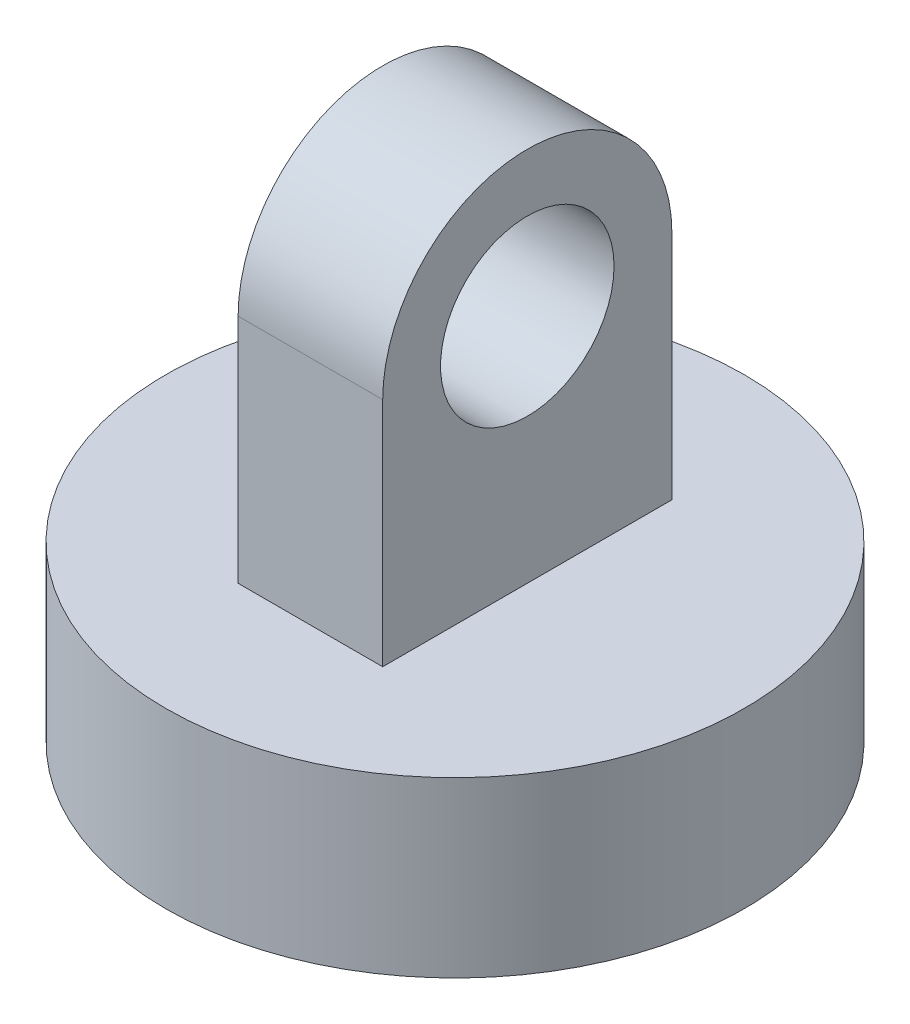
ISO-10303-21;
HEADER;
FILE_DESCRIPTION(('STEP AP214'),'2;1');
FILE_NAME('part.step','',(''),(''),'','','');
FILE_SCHEMA(('AUTOMOTIVE_DESIGN { 1 0 10303 214 1 1 1 1 }'));
ENDSEC;
DATA;
#1=APPLICATION_CONTEXT('core data for automotive mechanical design processes');
#2=APPLICATION_PROTOCOL_DEFINITION('international standard','automotive_design',2000,#1);
#3=PRODUCT_CONTEXT('',#1,'mechanical');
#4=PRODUCT('Part','Part','',(#3));
#5=PRODUCT_RELATED_PRODUCT_CATEGORY('part','',(#4));
#6=PRODUCT_DEFINITION_FORMATION('','',#4);
#7=PRODUCT_DEFINITION_CONTEXT('part definition',#1,'design');
#8=PRODUCT_DEFINITION('design','',#6,#7);
#9=PRODUCT_DEFINITION_SHAPE('','',#8);
#10=(LENGTH_UNIT() NAMED_UNIT(*) SI_UNIT(.MILLI.,.METRE.));
#11=(NAMED_UNIT(*) PLANE_ANGLE_UNIT() SI_UNIT($,.RADIAN.));
#12=(NAMED_UNIT(*) SI_UNIT($,.STERADIAN.) SOLID_ANGLE_UNIT());
#13=UNCERTAINTY_MEASURE_WITH_UNIT(LENGTH_MEASURE(1.E-05),#10,'distance_accuracy_value','');
#14=(GEOMETRIC_REPRESENTATION_CONTEXT(3) GLOBAL_UNCERTAINTY_ASSIGNED_CONTEXT((#13)) GLOBAL_UNIT_ASSIGNED_CONTEXT((#10,
#11,#12)) REPRESENTATION_CONTEXT('',''));
#15=CARTESIAN_POINT('',(0.,0.,0.));
#16=DIRECTION('',(0.,0.,1.));
#17=DIRECTION('',(1.,0.,0.));
#18=AXIS2_PLACEMENT_3D('',#15,#16,#17);
#19=CARTESIAN_POINT('',(0.,30.,0.));
#20=DIRECTION('',(0.,1.,0.));
#21=DIRECTION('',(0.,0.,1.));
#22=AXIS2_PLACEMENT_3D('',#19,#20,#21);
#23=PLANE('',#22);
#24=CARTESIAN_POINT('',(0.,30.,0.));
#25=DIRECTION('',(0.,1.,0.));
#26=DIRECTION('',(0.,0.,1.));
#27=AXIS2_PLACEMENT_3D('',#24,#25,#26);
#28=CIRCLE('',#27,50.);
#29=CARTESIAN_POINT('',(0.,30.,50.));
#30=VERTEX_POINT('',#29);
#31=EDGE_CURVE('E11',#30,#30,#28,.T.);
#32=ORIENTED_EDGE('',*,*,#31,.T.);
#33=EDGE_LOOP('',(#32));
#34=FACE_BOUND('',#33,.T.);
#35=DIRECTION('',(0.,0.,-1.));
#36=VECTOR('',#35,1.);
#37=CARTESIAN_POINT('',(12.5,30.,25.));
#38=LINE('',#37,#36);
#39=CARTESIAN_POINT('',(12.5,30.,25.));
#40=VERTEX_POINT('',#39);
#41=CARTESIAN_POINT('',(12.5,30.,-25.));
#42=VERTEX_POINT('',#41);
#43=EDGE_CURVE('E85',#40,#42,#38,.T.);
#44=ORIENTED_EDGE('',*,*,#43,.F.);
#45=DIRECTION('',(-1.,0.,0.));
#46=VECTOR('',#45,1.);
#47=CARTESIAN_POINT('',(12.5,30.,25.));
#48=LINE('',#47,#46);
#49=CARTESIAN_POINT('',(-12.5,30.,25.));
#50=VERTEX_POINT('',#49);
#51=EDGE_CURVE('E83',#40,#50,#48,.T.);
#52=ORIENTED_EDGE('',*,*,#51,.T.);
#53=DIRECTION('',(0.,0.,-1.));
#54=VECTOR('',#53,1.);
#55=CARTESIAN_POINT('',(-12.5,30.,25.));
#56=LINE('',#55,#54);
#57=CARTESIAN_POINT('',(-12.5,30.,-25.));
#58=VERTEX_POINT('',#57);
#59=EDGE_CURVE('E105',#50,#58,#56,.T.);
#60=ORIENTED_EDGE('',*,*,#59,.T.);
#61=DIRECTION('',(-1.,0.,0.));
#62=VECTOR('',#61,1.);
#63=CARTESIAN_POINT('',(12.5,30.,-25.));
#64=LINE('',#63,#62);
#65=EDGE_CURVE('E98',#42,#58,#64,.T.);
#66=ORIENTED_EDGE('',*,*,#65,.F.);
#67=EDGE_LOOP('',(#44,#52,#60,#66));
#68=FACE_BOUND('',#67,.T.);
#69=ADVANCED_FACE('F35',(#34,#68),#23,.T.);
#70=CARTESIAN_POINT('',(0.,30.,0.));
#71=DIRECTION('',(0.,-1.,0.));
#72=DIRECTION('',(0.,0.,-1.));
#73=AXIS2_PLACEMENT_3D('',#70,#71,#72);
#74=CYLINDRICAL_SURFACE('',#73,50.);
#75=ORIENTED_EDGE('',*,*,#31,.F.);
#76=EDGE_LOOP('',(#75));
#77=FACE_BOUND('',#76,.T.);
#78=CARTESIAN_POINT('',(0.,0.,0.));
#79=DIRECTION('',(0.,1.,0.));
#80=DIRECTION('',(0.,0.,1.));
#81=AXIS2_PLACEMENT_3D('',#78,#79,#80);
#82=CIRCLE('',#81,50.);
#83=CARTESIAN_POINT('',(0.,0.,50.));
#84=VERTEX_POINT('',#83);
#85=EDGE_CURVE('E39',#84,#84,#82,.T.);
#86=ORIENTED_EDGE('',*,*,#85,.T.);
#87=EDGE_LOOP('',(#86));
#88=FACE_BOUND('',#87,.T.);
#89=ADVANCED_FACE('F37',(#77,#88),#74,.T.);
#90=CARTESIAN_POINT('',(0.,0.,0.));
#91=DIRECTION('',(0.,1.,0.));
#92=DIRECTION('',(0.,0.,1.));
#93=AXIS2_PLACEMENT_3D('',#90,#91,#92);
#94=PLANE('',#93);
#95=ORIENTED_EDGE('',*,*,#85,.F.);
#96=EDGE_LOOP('',(#95));
#97=FACE_BOUND('',#96,.T.);
#98=ADVANCED_FACE('F124',(#97),#94,.F.);
#99=CARTESIAN_POINT('',(12.5,70.,0.));
#100=DIRECTION('',(1.,0.,0.));
#101=DIRECTION('',(0.,0.,-1.));
#102=AXIS2_PLACEMENT_3D('',#99,#100,#101);
#103=PLANE('',#102);
#104=CARTESIAN_POINT('',(12.5,70.,0.));
#105=DIRECTION('',(1.,0.,0.));
#106=DIRECTION('',(0.,0.,-1.));
#107=AXIS2_PLACEMENT_3D('',#104,#105,#106);
#108=CIRCLE('',#107,25.);
#109=CARTESIAN_POINT('',(12.5,70.,-25.));
#110=VERTEX_POINT('',#109);
#111=CARTESIAN_POINT('',(12.5,70.,25.));
#112=VERTEX_POINT('',#111);
#113=EDGE_CURVE('E86',#110,#112,#108,.T.);
#114=ORIENTED_EDGE('',*,*,#113,.T.);
#115=DIRECTION('',(0.,-1.,0.));
#116=VECTOR('',#115,1.);
#117=CARTESIAN_POINT('',(12.5,70.,25.));
#118=LINE('',#117,#116);
#119=EDGE_CURVE('E77',#112,#40,#118,.T.);
#120=ORIENTED_EDGE('',*,*,#119,.T.);
#121=ORIENTED_EDGE('',*,*,#43,.T.);
#122=DIRECTION('',(0.,1.,0.));
#123=VECTOR('',#122,1.);
#124=CARTESIAN_POINT('',(12.5,30.,-25.));
#125=LINE('',#124,#123);
#126=EDGE_CURVE('E50',#42,#110,#125,.T.);
#127=ORIENTED_EDGE('',*,*,#126,.T.);
#128=EDGE_LOOP('',(#114,#120,#121,#127));
#129=FACE_BOUND('',#128,.T.);
#130=CARTESIAN_POINT('',(12.5,70.,0.));
#131=DIRECTION('',(1.,0.,0.));
#132=DIRECTION('',(0.,0.,-1.));
#133=AXIS2_PLACEMENT_3D('',#130,#131,#132);
#134=CIRCLE('',#133,15.);
#135=CARTESIAN_POINT('',(12.5,70.,-15.));
#136=VERTEX_POINT('',#135);
#137=EDGE_CURVE('E111',#136,#136,#134,.T.);
#138=ORIENTED_EDGE('',*,*,#137,.F.);
#139=EDGE_LOOP('',(#138));
#140=FACE_BOUND('',#139,.T.);
#141=ADVANCED_FACE('F89',(#129,#140),#103,.T.);
#142=CARTESIAN_POINT('',(-12.5,70.,0.));
#143=DIRECTION('',(1.,0.,0.));
#144=DIRECTION('',(0.,0.,-1.));
#145=AXIS2_PLACEMENT_3D('',#142,#143,#144);
#146=PLANE('',#145);
#147=CARTESIAN_POINT('',(-12.5,70.,0.));
#148=DIRECTION('',(1.,0.,0.));
#149=DIRECTION('',(0.,0.,-1.));
#150=AXIS2_PLACEMENT_3D('',#147,#148,#149);
#151=CIRCLE('',#150,25.);
#152=CARTESIAN_POINT('',(-12.5,70.,-25.));
#153=VERTEX_POINT('',#152);
#154=CARTESIAN_POINT('',(-12.5,70.,25.));
#155=VERTEX_POINT('',#154);
#156=EDGE_CURVE('E95',#153,#155,#151,.T.);
#157=ORIENTED_EDGE('',*,*,#156,.F.);
#158=DIRECTION('',(0.,1.,0.));
#159=VECTOR('',#158,1.);
#160=CARTESIAN_POINT('',(-12.5,30.,-25.));
#161=LINE('',#160,#159);
#162=EDGE_CURVE('E71',#58,#153,#161,.T.);
#163=ORIENTED_EDGE('',*,*,#162,.F.);
#164=ORIENTED_EDGE('',*,*,#59,.F.);
#165=DIRECTION('',(0.,-1.,0.));
#166=VECTOR('',#165,1.);
#167=CARTESIAN_POINT('',(-12.5,70.,25.));
#168=LINE('',#167,#166);
#169=EDGE_CURVE('E108',#155,#50,#168,.T.);
#170=ORIENTED_EDGE('',*,*,#169,.F.);
#171=EDGE_LOOP('',(#157,#163,#164,#170));
#172=FACE_BOUND('',#171,.T.);
#173=CARTESIAN_POINT('',(-12.5,70.,0.));
#174=DIRECTION('',(1.,0.,0.));
#175=DIRECTION('',(0.,0.,-1.));
#176=AXIS2_PLACEMENT_3D('',#173,#174,#175);
#177=CIRCLE('',#176,15.);
#178=CARTESIAN_POINT('',(-12.5,70.,-15.));
#179=VERTEX_POINT('',#178);
#180=EDGE_CURVE('E114',#179,#179,#177,.T.);
#181=ORIENTED_EDGE('',*,*,#180,.T.);
#182=EDGE_LOOP('',(#181));
#183=FACE_BOUND('',#182,.T.);
#184=ADVANCED_FACE('F123',(#172,#183),#146,.F.);
#185=CARTESIAN_POINT('',(12.5,70.,0.));
#186=DIRECTION('',(-1.,0.,0.));
#187=DIRECTION('',(0.,0.,1.));
#188=AXIS2_PLACEMENT_3D('',#185,#186,#187);
#189=CYLINDRICAL_SURFACE('',#188,25.);
#190=ORIENTED_EDGE('',*,*,#156,.T.);
#191=DIRECTION('',(-1.,0.,0.));
#192=VECTOR('',#191,1.);
#193=CARTESIAN_POINT('',(12.5,70.,25.));
#194=LINE('',#193,#192);
#195=EDGE_CURVE('E80',#112,#155,#194,.T.);
#196=ORIENTED_EDGE('',*,*,#195,.F.);
#197=ORIENTED_EDGE('',*,*,#113,.F.);
#198=DIRECTION('',(-1.,0.,0.));
#199=VECTOR('',#198,1.);
#200=CARTESIAN_POINT('',(12.5,70.,-25.));
#201=LINE('',#200,#199);
#202=EDGE_CURVE('E102',#110,#153,#201,.T.);
#203=ORIENTED_EDGE('',*,*,#202,.T.);
#204=EDGE_LOOP('',(#190,#196,#197,#203));
#205=FACE_BOUND('',#204,.T.);
#206=ADVANCED_FACE('F93',(#205),#189,.T.);
#207=CARTESIAN_POINT('',(12.5,70.,25.));
#208=DIRECTION('',(0.,0.,-1.));
#209=DIRECTION('',(0.,1.,0.));
#210=AXIS2_PLACEMENT_3D('',#207,#208,#209);
#211=PLANE('',#210);
#212=ORIENTED_EDGE('',*,*,#169,.T.);
#213=ORIENTED_EDGE('',*,*,#51,.F.);
#214=ORIENTED_EDGE('',*,*,#119,.F.);
#215=ORIENTED_EDGE('',*,*,#195,.T.);
#216=EDGE_LOOP('',(#212,#213,#214,#215));
#217=FACE_BOUND('',#216,.T.);
#218=ADVANCED_FACE('F78',(#217),#211,.F.);
#219=CARTESIAN_POINT('',(12.5,30.,-25.));
#220=DIRECTION('',(0.,0.,1.));
#221=DIRECTION('',(0.,-1.,0.));
#222=AXIS2_PLACEMENT_3D('',#219,#220,#221);
#223=PLANE('',#222);
#224=ORIENTED_EDGE('',*,*,#162,.T.);
#225=ORIENTED_EDGE('',*,*,#202,.F.);
#226=ORIENTED_EDGE('',*,*,#126,.F.);
#227=ORIENTED_EDGE('',*,*,#65,.T.);
#228=EDGE_LOOP('',(#224,#225,#226,#227));
#229=FACE_BOUND('',#228,.T.);
#230=ADVANCED_FACE('F147',(#229),#223,.F.);
#231=CARTESIAN_POINT('',(12.5,70.,0.));
#232=DIRECTION('',(-1.,0.,0.));
#233=DIRECTION('',(0.,0.,1.));
#234=AXIS2_PLACEMENT_3D('',#231,#232,#233);
#235=CYLINDRICAL_SURFACE('',#234,15.);
#236=ORIENTED_EDGE('',*,*,#137,.T.);
#237=EDGE_LOOP('',(#236));
#238=FACE_BOUND('',#237,.T.);
#239=ORIENTED_EDGE('',*,*,#180,.F.);
#240=EDGE_LOOP('',(#239));
#241=FACE_BOUND('',#240,.T.);
#242=ADVANCED_FACE('F120',(#238,#241),#235,.F.);
#243=CLOSED_SHELL('',(#69,#89,#98,#141,#184,#206,#218,#230,#242));
#244=MANIFOLD_SOLID_BREP('B2',#243);
#245=ADVANCED_BREP_SHAPE_REPRESENTATION('',(#18,#244),#14);
#246=SHAPE_DEFINITION_REPRESENTATION(#9,#245);
ENDSEC;
END-ISO-10303-21;
